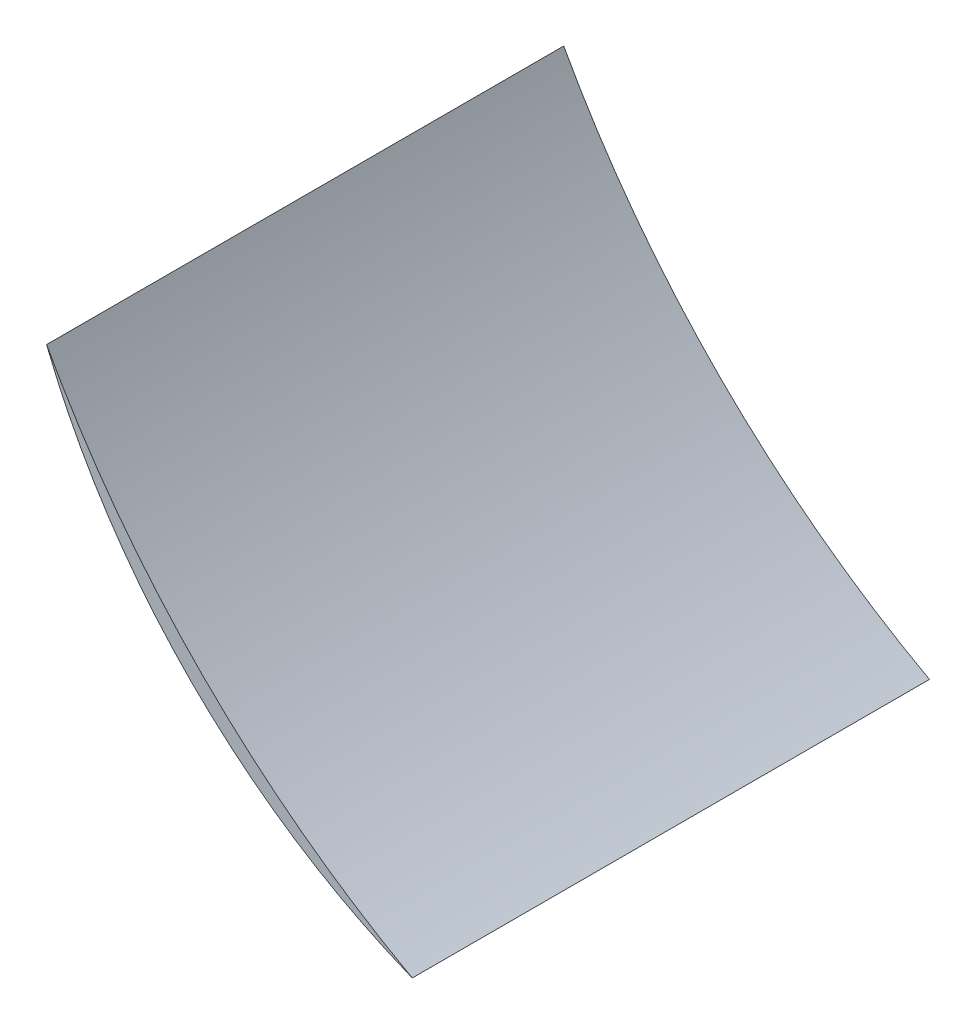
ISO-10303-21;
HEADER;
FILE_DESCRIPTION(('STEP AP214'),'2;1');
FILE_NAME('part.step','',(''),(''),'','','');
FILE_SCHEMA(('AUTOMOTIVE_DESIGN { 1 0 10303 214 1 1 1 1 }'));
ENDSEC;
DATA;
#1=APPLICATION_CONTEXT('core data for automotive mechanical design processes');
#2=APPLICATION_PROTOCOL_DEFINITION('international standard','automotive_design',2000,#1);
#3=PRODUCT_CONTEXT('',#1,'mechanical');
#4=PRODUCT('Part','Part','',(#3));
#5=PRODUCT_RELATED_PRODUCT_CATEGORY('part','',(#4));
#6=PRODUCT_DEFINITION_FORMATION('','',#4);
#7=PRODUCT_DEFINITION_CONTEXT('part definition',#1,'design');
#8=PRODUCT_DEFINITION('design','',#6,#7);
#9=PRODUCT_DEFINITION_SHAPE('','',#8);
#10=(LENGTH_UNIT() NAMED_UNIT(*) SI_UNIT(.MILLI.,.METRE.));
#11=(NAMED_UNIT(*) PLANE_ANGLE_UNIT() SI_UNIT($,.RADIAN.));
#12=(NAMED_UNIT(*) SI_UNIT($,.STERADIAN.) SOLID_ANGLE_UNIT());
#13=UNCERTAINTY_MEASURE_WITH_UNIT(LENGTH_MEASURE(1.E-05),#10,'distance_accuracy_value','');
#14=(GEOMETRIC_REPRESENTATION_CONTEXT(3) GLOBAL_UNCERTAINTY_ASSIGNED_CONTEXT((#13)) GLOBAL_UNIT_ASSIGNED_CONTEXT((#10,
#11,#12)) REPRESENTATION_CONTEXT('',''));
#15=CARTESIAN_POINT('',(0.,0.,0.));
#16=DIRECTION('',(0.,0.,1.));
#17=DIRECTION('',(1.,0.,0.));
#18=AXIS2_PLACEMENT_3D('',#15,#16,#17);
#19=CARTESIAN_POINT('',(114.808,56.388,0.));
#20=DIRECTION('',(0.,0.,-1.));
#21=DIRECTION('',(1.,0.,0.));
#22=AXIS2_PLACEMENT_3D('',#19,#20,#21);
#23=CYLINDRICAL_SURFACE('',#22,0.3556);
#24=DIRECTION('',(0.,0.,1.));
#25=VECTOR('',#24,1.);
#26=CARTESIAN_POINT('',(114.495984743901,56.2174191102106,0.));
#27=LINE('',#26,#25);
#28=CARTESIAN_POINT('',(114.495984743901,56.2174191102106,0.));
#29=VERTEX_POINT('',#28);
#30=CARTESIAN_POINT('',(114.495984743901,56.2174191102106,0.1999996));
#31=VERTEX_POINT('',#30);
#32=EDGE_CURVE('E11',#29,#31,#27,.T.);
#33=ORIENTED_EDGE('',*,*,#32,.T.);
#34=CARTESIAN_POINT('',(114.808,56.388,0.1999996));
#35=DIRECTION('',(0.,0.,1.));
#36=DIRECTION('',(1.,0.,0.));
#37=AXIS2_PLACEMENT_3D('',#34,#35,#36);
#38=CIRCLE('',#37,0.3556);
#39=CARTESIAN_POINT('',(114.637419110211,56.0759847439008,0.1999996));
#40=VERTEX_POINT('',#39);
#41=EDGE_CURVE('E24',#31,#40,#38,.T.);
#42=ORIENTED_EDGE('',*,*,#41,.T.);
#43=DIRECTION('',(0.,0.,1.));
#44=VECTOR('',#43,1.);
#45=CARTESIAN_POINT('',(114.637419110211,56.0759847439008,0.));
#46=LINE('',#45,#44);
#47=CARTESIAN_POINT('',(114.637419110211,56.0759847439008,0.));
#48=VERTEX_POINT('',#47);
#49=EDGE_CURVE('E40',#48,#40,#46,.T.);
#50=ORIENTED_EDGE('',*,*,#49,.F.);
#51=CARTESIAN_POINT('',(114.808,56.388,0.));
#52=DIRECTION('',(0.,0.,1.));
#53=DIRECTION('',(1.,0.,0.));
#54=AXIS2_PLACEMENT_3D('',#51,#52,#53);
#55=CIRCLE('',#54,0.3556);
#56=EDGE_CURVE('E42',#29,#48,#55,.T.);
#57=ORIENTED_EDGE('',*,*,#56,.F.);
#58=EDGE_LOOP('',(#33,#42,#50,#57));
#59=FACE_BOUND('',#58,.T.);
#60=ADVANCED_FACE('F17',(#59),#23,.F.);
#61=CARTESIAN_POINT('',(114.7318,56.3118,0.));
#62=DIRECTION('',(0.,0.,-1.));
#63=DIRECTION('',(-0.707106781186548,0.707106781186548,0.));
#64=AXIS2_PLACEMENT_3D('',#61,#62,#63);
#65=CYLINDRICAL_SURFACE('',#64,0.254001156230771);
#66=CARTESIAN_POINT('',(114.7318,56.3118,0.1999996));
#67=DIRECTION('',(0.,0.,1.));
#68=DIRECTION('',(-0.707106781186548,0.707106781186548,0.));
#69=AXIS2_PLACEMENT_3D('',#66,#67,#68);
#70=CIRCLE('',#69,0.254001156230771);
#71=EDGE_CURVE('E49',#31,#40,#70,.T.);
#72=ORIENTED_EDGE('',*,*,#71,.F.);
#73=ORIENTED_EDGE('',*,*,#32,.F.);
#74=CARTESIAN_POINT('',(114.7318,56.3118,0.));
#75=DIRECTION('',(0.,0.,1.));
#76=DIRECTION('',(-0.707106781186548,0.707106781186548,0.));
#77=AXIS2_PLACEMENT_3D('',#74,#75,#76);
#78=CIRCLE('',#77,0.254001156230771);
#79=EDGE_CURVE('E48',#29,#48,#78,.T.);
#80=ORIENTED_EDGE('',*,*,#79,.T.);
#81=ORIENTED_EDGE('',*,*,#49,.T.);
#82=EDGE_LOOP('',(#72,#73,#80,#81));
#83=FACE_BOUND('',#82,.T.);
#84=ADVANCED_FACE('F51',(#83),#65,.T.);
#85=CARTESIAN_POINT('',(114.91140594,56.13219406,0.));
#86=DIRECTION('',(0.,0.,-1.));
#87=DIRECTION('',(-1.,0.,0.));
#88=AXIS2_PLACEMENT_3D('',#85,#86,#87);
#89=PLANE('',#88);
#90=ORIENTED_EDGE('',*,*,#56,.T.);
#91=ORIENTED_EDGE('',*,*,#79,.F.);
#92=EDGE_LOOP('',(#90,#91));
#93=FACE_BOUND('',#92,.T.);
#94=ADVANCED_FACE('F47',(#93),#89,.T.);
#95=CARTESIAN_POINT('',(114.91140594,56.13219406,0.1999996));
#96=DIRECTION('',(0.,0.,-1.));
#97=DIRECTION('',(-1.,0.,0.));
#98=AXIS2_PLACEMENT_3D('',#95,#96,#97);
#99=PLANE('',#98);
#100=ORIENTED_EDGE('',*,*,#71,.T.);
#101=ORIENTED_EDGE('',*,*,#41,.F.);
#102=EDGE_LOOP('',(#100,#101));
#103=FACE_BOUND('',#102,.T.);
#104=ADVANCED_FACE('F55',(#103),#99,.F.);
#105=CLOSED_SHELL('',(#60,#84,#94,#104));
#106=MANIFOLD_SOLID_BREP('B1',#105);
#107=ADVANCED_BREP_SHAPE_REPRESENTATION('',(#18,#106),#14);
#108=SHAPE_DEFINITION_REPRESENTATION(#9,#107);
ENDSEC;
END-ISO-10303-21;
